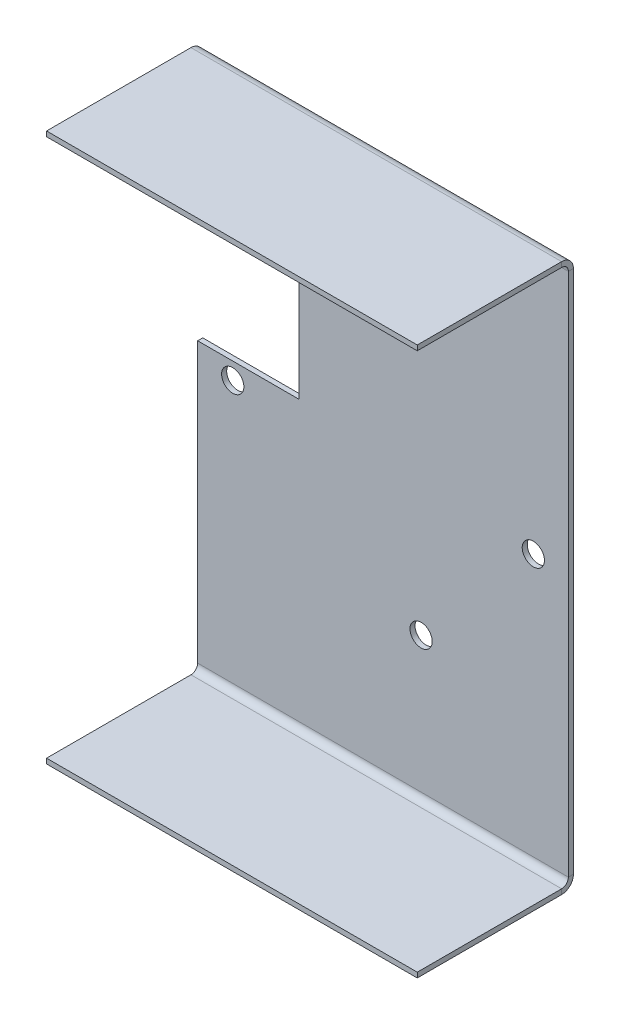
ISO-10303-21;
HEADER;
FILE_DESCRIPTION(('STEP AP214'),'2;1');
FILE_NAME('part.step','',(''),(''),'','','');
FILE_SCHEMA(('AUTOMOTIVE_DESIGN { 1 0 10303 214 1 1 1 1 }'));
ENDSEC;
DATA;
#1=APPLICATION_CONTEXT('core data for automotive mechanical design processes');
#2=APPLICATION_PROTOCOL_DEFINITION('international standard','automotive_design',2000,#1);
#3=PRODUCT_CONTEXT('',#1,'mechanical');
#4=PRODUCT('Part','Part','',(#3));
#5=PRODUCT_RELATED_PRODUCT_CATEGORY('part','',(#4));
#6=PRODUCT_DEFINITION_FORMATION('','',#4);
#7=PRODUCT_DEFINITION_CONTEXT('part definition',#1,'design');
#8=PRODUCT_DEFINITION('design','',#6,#7);
#9=PRODUCT_DEFINITION_SHAPE('','',#8);
#10=(LENGTH_UNIT() NAMED_UNIT(*) SI_UNIT(.MILLI.,.METRE.));
#11=(NAMED_UNIT(*) PLANE_ANGLE_UNIT() SI_UNIT($,.RADIAN.));
#12=(NAMED_UNIT(*) SI_UNIT($,.STERADIAN.) SOLID_ANGLE_UNIT());
#13=UNCERTAINTY_MEASURE_WITH_UNIT(LENGTH_MEASURE(1.E-05),#10,'distance_accuracy_value','');
#14=(GEOMETRIC_REPRESENTATION_CONTEXT(3) GLOBAL_UNCERTAINTY_ASSIGNED_CONTEXT((#13)) GLOBAL_UNIT_ASSIGNED_CONTEXT((#10,
#11,#12)) REPRESENTATION_CONTEXT('',''));
#15=CARTESIAN_POINT('',(0.,0.,0.));
#16=DIRECTION('',(0.,0.,1.));
#17=DIRECTION('',(1.,0.,0.));
#18=AXIS2_PLACEMENT_3D('',#15,#16,#17);
#19=CARTESIAN_POINT('',(-55.,125.,1.5));
#20=DIRECTION('',(-1.,0.,0.));
#21=DIRECTION('',(0.,-1.,0.));
#22=AXIS2_PLACEMENT_3D('',#19,#20,#21);
#23=PLANE('',#22);
#24=DIRECTION('',(0.,0.,-1.));
#25=VECTOR('',#24,1.);
#26=CARTESIAN_POINT('',(-55.,68.,10.));
#27=LINE('',#26,#25);
#28=CARTESIAN_POINT('',(-55.,68.,1.5));
#29=VERTEX_POINT('',#28);
#30=CARTESIAN_POINT('',(-55.,68.,0.));
#31=VERTEX_POINT('',#30);
#32=EDGE_CURVE('E190',#29,#31,#27,.T.);
#33=ORIENTED_EDGE('',*,*,#32,.F.);
#34=DIRECTION('',(0.,-1.,0.));
#35=VECTOR('',#34,1.);
#36=CARTESIAN_POINT('',(-55.,125.,1.5));
#37=LINE('',#36,#35);
#38=CARTESIAN_POINT('',(-54.9999999999999,77.840155050657,1.5));
#39=VERTEX_POINT('',#38);
#40=EDGE_CURVE('E208',#39,#29,#37,.T.);
#41=ORIENTED_EDGE('',*,*,#40,.F.);
#42=DIRECTION('',(0.,0.,-1.));
#43=VECTOR('',#42,1.);
#44=CARTESIAN_POINT('',(-55.,77.840155050657,1.5));
#45=LINE('',#44,#43);
#46=CARTESIAN_POINT('',(-55.,77.840155050657,0.));
#47=VERTEX_POINT('',#46);
#48=EDGE_CURVE('E14',#39,#47,#45,.T.);
#49=ORIENTED_EDGE('',*,*,#48,.T.);
#50=DIRECTION('',(0.,1.,0.));
#51=VECTOR('',#50,1.);
#52=CARTESIAN_POINT('',(-55.,0.,0.));
#53=LINE('',#52,#51);
#54=EDGE_CURVE('E197',#47,#31,#53,.F.);
#55=ORIENTED_EDGE('',*,*,#54,.T.);
#56=EDGE_LOOP('',(#33,#41,#49,#55));
#57=FACE_BOUND('',#56,.T.);
#58=ADVANCED_FACE('F58',(#57),#23,.T.);
#59=CARTESIAN_POINT('',(0.,0.,1.5));
#60=DIRECTION('',(0.,0.,1.));
#61=DIRECTION('',(1.,0.,0.));
#62=AXIS2_PLACEMENT_3D('',#59,#60,#61);
#63=PLANE('',#62);
#64=DIRECTION('',(-1.,0.,0.));
#65=VECTOR('',#64,1.);
#66=CARTESIAN_POINT('',(0.,68.,1.5));
#67=LINE('',#66,#65);
#68=CARTESIAN_POINT('',(-25.,68.,1.5));
#69=VERTEX_POINT('',#68);
#70=EDGE_CURVE('E305',#69,#29,#67,.T.);
#71=ORIENTED_EDGE('',*,*,#70,.F.);
#72=DIRECTION('',(0.,1.,0.));
#73=VECTOR('',#72,1.);
#74=CARTESIAN_POINT('',(-25.,0.,1.5));
#75=LINE('',#74,#73);
#76=CARTESIAN_POINT('',(-25.,5.,1.5));
#77=VERTEX_POINT('',#76);
#78=EDGE_CURVE('E349',#77,#69,#75,.T.);
#79=ORIENTED_EDGE('',*,*,#78,.F.);
#80=DIRECTION('',(1.,0.,0.));
#81=VECTOR('',#80,1.);
#82=CARTESIAN_POINT('',(0.,5.,1.5));
#83=LINE('',#82,#81);
#84=CARTESIAN_POINT('',(-55.,5.,1.5));
#85=VERTEX_POINT('',#84);
#86=EDGE_CURVE('E378',#85,#77,#83,.T.);
#87=ORIENTED_EDGE('',*,*,#86,.F.);
#88=CARTESIAN_POINT('',(-55.,-77.840155050657,1.5));
#89=VERTEX_POINT('',#88);
#90=EDGE_CURVE('E189',#85,#89,#37,.T.);
#91=ORIENTED_EDGE('',*,*,#90,.T.);
#92=DIRECTION('',(-1.,0.,0.));
#93=VECTOR('',#92,1.);
#94=CARTESIAN_POINT('',(0.,-77.840155050657,1.5));
#95=LINE('',#94,#93);
#96=CARTESIAN_POINT('',(55.,-77.840155050657,1.50000000000001));
#97=VERTEX_POINT('',#96);
#98=EDGE_CURVE('E239',#97,#89,#95,.T.);
#99=ORIENTED_EDGE('',*,*,#98,.F.);
#100=DIRECTION('',(0.,1.,0.));
#101=VECTOR('',#100,1.);
#102=CARTESIAN_POINT('',(55.,125.,1.5));
#103=LINE('',#102,#101);
#104=CARTESIAN_POINT('',(55.,77.840155050657,1.5));
#105=VERTEX_POINT('',#104);
#106=EDGE_CURVE('E62',#97,#105,#103,.T.);
#107=ORIENTED_EDGE('',*,*,#106,.T.);
#108=DIRECTION('',(-1.,0.,0.));
#109=VECTOR('',#108,1.);
#110=CARTESIAN_POINT('',(0.,77.840155050657,1.5));
#111=LINE('',#110,#109);
#112=EDGE_CURVE('E268',#105,#39,#111,.T.);
#113=ORIENTED_EDGE('',*,*,#112,.T.);
#114=ORIENTED_EDGE('',*,*,#40,.T.);
#115=EDGE_LOOP('',(#71,#79,#87,#91,#99,#107,#113,#114));
#116=FACE_BOUND('',#115,.T.);
#117=CARTESIAN_POINT('',(0.,51.,1.5));
#118=DIRECTION('',(0.,0.,1.));
#119=DIRECTION('',(1.,0.,0.));
#120=AXIS2_PLACEMENT_3D('',#117,#118,#119);
#121=CIRCLE('',#120,3.3);
#122=CARTESIAN_POINT('',(3.30000000000001,51.,1.5));
#123=VERTEX_POINT('',#122);
#124=EDGE_CURVE('E216',#123,#123,#121,.T.);
#125=ORIENTED_EDGE('',*,*,#124,.F.);
#126=EDGE_LOOP('',(#125));
#127=FACE_BOUND('',#126,.T.);
#128=CARTESIAN_POINT('',(-44.6,0.,1.5));
#129=DIRECTION('',(0.,0.,1.));
#130=DIRECTION('',(1.,0.,0.));
#131=AXIS2_PLACEMENT_3D('',#128,#129,#130);
#132=CIRCLE('',#131,3.3);
#133=CARTESIAN_POINT('',(-41.3,0.,1.5));
#134=VERTEX_POINT('',#133);
#135=EDGE_CURVE('E219',#134,#134,#132,.T.);
#136=ORIENTED_EDGE('',*,*,#135,.F.);
#137=EDGE_LOOP('',(#136));
#138=FACE_BOUND('',#137,.T.);
#139=CARTESIAN_POINT('',(44.6,0.,1.5));
#140=DIRECTION('',(0.,0.,1.));
#141=DIRECTION('',(1.,0.,0.));
#142=AXIS2_PLACEMENT_3D('',#139,#140,#141);
#143=CIRCLE('',#142,3.3);
#144=CARTESIAN_POINT('',(47.9,0.,1.5));
#145=VERTEX_POINT('',#144);
#146=EDGE_CURVE('E224',#145,#145,#143,.T.);
#147=ORIENTED_EDGE('',*,*,#146,.F.);
#148=EDGE_LOOP('',(#147));
#149=FACE_BOUND('',#148,.T.);
#150=CARTESIAN_POINT('',(11.3,-37.5,1.5));
#151=DIRECTION('',(0.,0.,1.));
#152=DIRECTION('',(1.,0.,0.));
#153=AXIS2_PLACEMENT_3D('',#150,#151,#152);
#154=CIRCLE('',#153,3.3);
#155=CARTESIAN_POINT('',(14.6,-37.5,1.5));
#156=VERTEX_POINT('',#155);
#157=EDGE_CURVE('E231',#156,#156,#154,.T.);
#158=ORIENTED_EDGE('',*,*,#157,.F.);
#159=EDGE_LOOP('',(#158));
#160=FACE_BOUND('',#159,.T.);
#161=ADVANCED_FACE('F302',(#116,#127,#138,#149,#160),#63,.T.);
#162=CARTESIAN_POINT('',(55.,125.,1.5));
#163=DIRECTION('',(1.,0.,0.));
#164=DIRECTION('',(0.,1.,0.));
#165=AXIS2_PLACEMENT_3D('',#162,#163,#164);
#166=PLANE('',#165);
#167=DIRECTION('',(0.,1.,0.));
#168=VECTOR('',#167,1.);
#169=CARTESIAN_POINT('',(55.,0.,0.));
#170=LINE('',#169,#168);
#171=CARTESIAN_POINT('',(55.,-77.840155050657,0.));
#172=VERTEX_POINT('',#171);
#173=CARTESIAN_POINT('',(55.,77.840155050657,0.));
#174=VERTEX_POINT('',#173);
#175=EDGE_CURVE('E205',#172,#174,#170,.T.);
#176=ORIENTED_EDGE('',*,*,#175,.T.);
#177=DIRECTION('',(0.,0.,1.));
#178=VECTOR('',#177,1.);
#179=CARTESIAN_POINT('',(55.,77.840155050657,1.5));
#180=LINE('',#179,#178);
#181=EDGE_CURVE('E276',#174,#105,#180,.T.);
#182=ORIENTED_EDGE('',*,*,#181,.T.);
#183=ORIENTED_EDGE('',*,*,#106,.F.);
#184=DIRECTION('',(0.,0.,1.));
#185=VECTOR('',#184,1.);
#186=CARTESIAN_POINT('',(55.,-77.840155050657,1.49999999999858));
#187=LINE('',#186,#185);
#188=EDGE_CURVE('E234',#172,#97,#187,.T.);
#189=ORIENTED_EDGE('',*,*,#188,.F.);
#190=EDGE_LOOP('',(#176,#182,#183,#189));
#191=FACE_BOUND('',#190,.T.);
#192=ADVANCED_FACE('F307',(#191),#166,.T.);
#193=DIRECTION('',(0.,0.,-1.));
#194=VECTOR('',#193,1.);
#195=CARTESIAN_POINT('',(-55.,5.,10.));
#196=LINE('',#195,#194);
#197=CARTESIAN_POINT('',(-55.,5.,0.));
#198=VERTEX_POINT('',#197);
#199=EDGE_CURVE('E177',#85,#198,#196,.T.);
#200=ORIENTED_EDGE('',*,*,#199,.T.);
#201=CARTESIAN_POINT('',(-55.,-77.840155050657,0.));
#202=VERTEX_POINT('',#201);
#203=EDGE_CURVE('E187',#198,#202,#53,.F.);
#204=ORIENTED_EDGE('',*,*,#203,.T.);
#205=DIRECTION('',(0.,0.,-1.));
#206=VECTOR('',#205,1.);
#207=CARTESIAN_POINT('',(-55.,-77.840155050657,1.49999999999858));
#208=LINE('',#207,#206);
#209=EDGE_CURVE('E237',#89,#202,#208,.T.);
#210=ORIENTED_EDGE('',*,*,#209,.F.);
#211=ORIENTED_EDGE('',*,*,#90,.F.);
#212=EDGE_LOOP('',(#200,#204,#210,#211));
#213=FACE_BOUND('',#212,.T.);
#214=ADVANCED_FACE('F60',(#213),#23,.T.);
#215=CARTESIAN_POINT('',(-55.,-79.8401550506578,-203.659844949343));
#216=DIRECTION('',(-1.,0.,0.));
#217=DIRECTION('',(0.,0.,1.));
#218=AXIS2_PLACEMENT_3D('',#215,#216,#217);
#219=PLANE('',#218);
#220=DIRECTION('',(0.,0.,1.));
#221=VECTOR('',#220,1.);
#222=CARTESIAN_POINT('',(-55.,-79.8401550506578,-203.659844949343));
#223=LINE('',#222,#221);
#224=CARTESIAN_POINT('',(-55.,-79.840155050657,3.5));
#225=VERTEX_POINT('',#224);
#226=CARTESIAN_POINT('',(-55.,-79.8401550506569,46.340155050657));
#227=VERTEX_POINT('',#226);
#228=EDGE_CURVE('E247',#225,#227,#223,.T.);
#229=ORIENTED_EDGE('',*,*,#228,.F.);
#230=DIRECTION('',(0.,-1.,0.));
#231=VECTOR('',#230,1.);
#232=CARTESIAN_POINT('',(-55.,-79.8401550506585,3.5));
#233=LINE('',#232,#231);
#234=CARTESIAN_POINT('',(-55.,-81.340155050657,3.50000000000001));
#235=VERTEX_POINT('',#234);
#236=EDGE_CURVE('E265',#225,#235,#233,.T.);
#237=ORIENTED_EDGE('',*,*,#236,.T.);
#238=DIRECTION('',(0.,0.,-1.));
#239=VECTOR('',#238,1.);
#240=CARTESIAN_POINT('',(-55.,-81.3401550506573,-78.659844949343));
#241=LINE('',#240,#239);
#242=CARTESIAN_POINT('',(-55.,-81.3401550506569,46.340155050657));
#243=VERTEX_POINT('',#242);
#244=EDGE_CURVE('E252',#235,#243,#241,.F.);
#245=ORIENTED_EDGE('',*,*,#244,.T.);
#246=DIRECTION('',(0.,1.,0.));
#247=VECTOR('',#246,1.);
#248=CARTESIAN_POINT('',(-55.,-79.8401550506569,46.340155050657));
#249=LINE('',#248,#247);
#250=EDGE_CURVE('E254',#243,#227,#249,.T.);
#251=ORIENTED_EDGE('',*,*,#250,.T.);
#252=EDGE_LOOP('',(#229,#237,#245,#251));
#253=FACE_BOUND('',#252,.T.);
#254=ADVANCED_FACE('F406',(#253),#219,.T.);
#255=CARTESIAN_POINT('',(55.,-79.8401550506578,-203.659844949343));
#256=DIRECTION('',(1.,0.,0.));
#257=DIRECTION('',(0.,0.,-1.));
#258=AXIS2_PLACEMENT_3D('',#255,#256,#257);
#259=PLANE('',#258);
#260=DIRECTION('',(0.,0.,-1.));
#261=VECTOR('',#260,1.);
#262=CARTESIAN_POINT('',(55.,-81.3401550506573,-78.659844949343));
#263=LINE('',#262,#261);
#264=CARTESIAN_POINT('',(55.,-81.3401550506569,46.340155050657));
#265=VERTEX_POINT('',#264);
#266=CARTESIAN_POINT('',(54.9999999999999,-81.340155050657,3.50000000000001));
#267=VERTEX_POINT('',#266);
#268=EDGE_CURVE('E200',#265,#267,#263,.T.);
#269=ORIENTED_EDGE('',*,*,#268,.T.);
#270=DIRECTION('',(0.,1.,0.));
#271=VECTOR('',#270,1.);
#272=CARTESIAN_POINT('',(55.,-79.8401550506585,3.5));
#273=LINE('',#272,#271);
#274=CARTESIAN_POINT('',(55.,-79.840155050657,3.50000000000001));
#275=VERTEX_POINT('',#274);
#276=EDGE_CURVE('E260',#267,#275,#273,.T.);
#277=ORIENTED_EDGE('',*,*,#276,.T.);
#278=DIRECTION('',(0.,0.,-1.));
#279=VECTOR('',#278,1.);
#280=CARTESIAN_POINT('',(55.,-79.8401550506578,-203.659844949343));
#281=LINE('',#280,#279);
#282=CARTESIAN_POINT('',(55.,-79.8401550506569,46.340155050657));
#283=VERTEX_POINT('',#282);
#284=EDGE_CURVE('E251',#283,#275,#281,.T.);
#285=ORIENTED_EDGE('',*,*,#284,.F.);
#286=DIRECTION('',(0.,1.,0.));
#287=VECTOR('',#286,1.);
#288=CARTESIAN_POINT('',(55.,-79.8401550506569,46.340155050657));
#289=LINE('',#288,#287);
#290=EDGE_CURVE('E246',#265,#283,#289,.T.);
#291=ORIENTED_EDGE('',*,*,#290,.F.);
#292=EDGE_LOOP('',(#269,#277,#285,#291));
#293=FACE_BOUND('',#292,.T.);
#294=ADVANCED_FACE('F411',(#293),#259,.T.);
#295=CARTESIAN_POINT('',(0.,-79.8401550506573,-78.659844949343));
#296=DIRECTION('',(0.,1.,0.));
#297=DIRECTION('',(1.,0.,0.));
#298=AXIS2_PLACEMENT_3D('',#295,#296,#297);
#299=PLANE('',#298);
#300=ORIENTED_EDGE('',*,*,#284,.T.);
#301=DIRECTION('',(-1.,0.,0.));
#302=VECTOR('',#301,1.);
#303=CARTESIAN_POINT('',(0.,-79.840155050657,3.5));
#304=LINE('',#303,#302);
#305=EDGE_CURVE('E257',#275,#225,#304,.T.);
#306=ORIENTED_EDGE('',*,*,#305,.T.);
#307=ORIENTED_EDGE('',*,*,#228,.T.);
#308=DIRECTION('',(1.,0.,0.));
#309=VECTOR('',#308,1.);
#310=CARTESIAN_POINT('',(-55.,-79.8401550506569,46.340155050657));
#311=LINE('',#310,#309);
#312=EDGE_CURVE('E243',#227,#283,#311,.T.);
#313=ORIENTED_EDGE('',*,*,#312,.T.);
#314=EDGE_LOOP('',(#300,#306,#307,#313));
#315=FACE_BOUND('',#314,.T.);
#316=ADVANCED_FACE('F441',(#315),#299,.T.);
#317=CARTESIAN_POINT('',(-55.,-79.8401550506569,46.340155050657));
#318=DIRECTION('',(0.,0.,1.));
#319=DIRECTION('',(1.,0.,0.));
#320=AXIS2_PLACEMENT_3D('',#317,#318,#319);
#321=PLANE('',#320);
#322=ORIENTED_EDGE('',*,*,#250,.F.);
#323=DIRECTION('',(1.,0.,0.));
#324=VECTOR('',#323,1.);
#325=CARTESIAN_POINT('',(0.,-81.3401550506569,46.340155050657));
#326=LINE('',#325,#324);
#327=EDGE_CURVE('E248',#243,#265,#326,.T.);
#328=ORIENTED_EDGE('',*,*,#327,.T.);
#329=ORIENTED_EDGE('',*,*,#290,.T.);
#330=ORIENTED_EDGE('',*,*,#312,.F.);
#331=EDGE_LOOP('',(#322,#328,#329,#330));
#332=FACE_BOUND('',#331,.T.);
#333=ADVANCED_FACE('F438',(#332),#321,.T.);
#334=CARTESIAN_POINT('',(0.,-81.3401550506573,-78.659844949343));
#335=DIRECTION('',(0.,1.,0.));
#336=DIRECTION('',(1.,0.,0.));
#337=AXIS2_PLACEMENT_3D('',#334,#335,#336);
#338=PLANE('',#337);
#339=DIRECTION('',(-1.,0.,0.));
#340=VECTOR('',#339,1.);
#341=CARTESIAN_POINT('',(0.,-81.340155050657,3.49999999999999));
#342=LINE('',#341,#340);
#343=EDGE_CURVE('E263',#267,#235,#342,.T.);
#344=ORIENTED_EDGE('',*,*,#343,.F.);
#345=ORIENTED_EDGE('',*,*,#268,.F.);
#346=ORIENTED_EDGE('',*,*,#327,.F.);
#347=ORIENTED_EDGE('',*,*,#244,.F.);
#348=EDGE_LOOP('',(#344,#345,#346,#347));
#349=FACE_BOUND('',#348,.T.);
#350=ADVANCED_FACE('F320',(#349),#338,.F.);
#351=CARTESIAN_POINT('',(11.3,-37.5,1.5));
#352=DIRECTION('',(0.,0.,1.));
#353=DIRECTION('',(1.,0.,0.));
#354=AXIS2_PLACEMENT_3D('',#351,#352,#353);
#355=CYLINDRICAL_SURFACE('',#354,3.3);
#356=ORIENTED_EDGE('',*,*,#157,.T.);
#357=EDGE_LOOP('',(#356));
#358=FACE_BOUND('',#357,.T.);
#359=CARTESIAN_POINT('',(11.3,-37.5,0.));
#360=DIRECTION('',(0.,0.,1.));
#361=DIRECTION('',(1.,0.,0.));
#362=AXIS2_PLACEMENT_3D('',#359,#360,#361);
#363=CIRCLE('',#362,3.3);
#364=CARTESIAN_POINT('',(14.6,-37.5,0.));
#365=VERTEX_POINT('',#364);
#366=EDGE_CURVE('E207',#365,#365,#363,.T.);
#367=ORIENTED_EDGE('',*,*,#366,.F.);
#368=EDGE_LOOP('',(#367));
#369=FACE_BOUND('',#368,.T.);
#370=ADVANCED_FACE('F316',(#358,#369),#355,.F.);
#371=CARTESIAN_POINT('',(44.6,0.,1.5));
#372=DIRECTION('',(0.,0.,1.));
#373=DIRECTION('',(1.,0.,0.));
#374=AXIS2_PLACEMENT_3D('',#371,#372,#373);
#375=CYLINDRICAL_SURFACE('',#374,3.3);
#376=ORIENTED_EDGE('',*,*,#146,.T.);
#377=EDGE_LOOP('',(#376));
#378=FACE_BOUND('',#377,.T.);
#379=CARTESIAN_POINT('',(44.6,0.,0.));
#380=DIRECTION('',(0.,0.,1.));
#381=DIRECTION('',(1.,0.,0.));
#382=AXIS2_PLACEMENT_3D('',#379,#380,#381);
#383=CIRCLE('',#382,3.3);
#384=CARTESIAN_POINT('',(47.9,0.,0.));
#385=VERTEX_POINT('',#384);
#386=EDGE_CURVE('E324',#385,#385,#383,.T.);
#387=ORIENTED_EDGE('',*,*,#386,.F.);
#388=EDGE_LOOP('',(#387));
#389=FACE_BOUND('',#388,.T.);
#390=ADVANCED_FACE('F319',(#378,#389),#375,.F.);
#391=CARTESIAN_POINT('',(-44.6,0.,1.5));
#392=DIRECTION('',(0.,0.,1.));
#393=DIRECTION('',(1.,0.,0.));
#394=AXIS2_PLACEMENT_3D('',#391,#392,#393);
#395=CYLINDRICAL_SURFACE('',#394,3.3);
#396=ORIENTED_EDGE('',*,*,#135,.T.);
#397=EDGE_LOOP('',(#396));
#398=FACE_BOUND('',#397,.T.);
#399=CARTESIAN_POINT('',(-44.6,0.,0.));
#400=DIRECTION('',(0.,0.,1.));
#401=DIRECTION('',(1.,0.,0.));
#402=AXIS2_PLACEMENT_3D('',#399,#400,#401);
#403=CIRCLE('',#402,3.3);
#404=CARTESIAN_POINT('',(-41.3,0.,0.));
#405=VERTEX_POINT('',#404);
#406=EDGE_CURVE('E326',#405,#405,#403,.T.);
#407=ORIENTED_EDGE('',*,*,#406,.F.);
#408=EDGE_LOOP('',(#407));
#409=FACE_BOUND('',#408,.T.);
#410=ADVANCED_FACE('F428',(#398,#409),#395,.F.);
#411=CARTESIAN_POINT('',(0.,51.,1.5));
#412=DIRECTION('',(0.,0.,1.));
#413=DIRECTION('',(1.,0.,0.));
#414=AXIS2_PLACEMENT_3D('',#411,#412,#413);
#415=CYLINDRICAL_SURFACE('',#414,3.3);
#416=ORIENTED_EDGE('',*,*,#124,.T.);
#417=EDGE_LOOP('',(#416));
#418=FACE_BOUND('',#417,.T.);
#419=CARTESIAN_POINT('',(0.,51.,0.));
#420=DIRECTION('',(0.,0.,1.));
#421=DIRECTION('',(1.,0.,0.));
#422=AXIS2_PLACEMENT_3D('',#419,#420,#421);
#423=CIRCLE('',#422,3.3);
#424=CARTESIAN_POINT('',(3.30000000000001,51.,0.));
#425=VERTEX_POINT('',#424);
#426=EDGE_CURVE('E201',#425,#425,#423,.T.);
#427=ORIENTED_EDGE('',*,*,#426,.F.);
#428=EDGE_LOOP('',(#427));
#429=FACE_BOUND('',#428,.T.);
#430=ADVANCED_FACE('F420',(#418,#429),#415,.F.);
#431=CARTESIAN_POINT('',(0.,0.,0.));
#432=DIRECTION('',(0.,0.,1.));
#433=DIRECTION('',(1.,0.,0.));
#434=AXIS2_PLACEMENT_3D('',#431,#432,#433);
#435=PLANE('',#434);
#436=DIRECTION('',(0.,-1.,0.));
#437=VECTOR('',#436,1.);
#438=CARTESIAN_POINT('',(-25.,5.,0.));
#439=LINE('',#438,#437);
#440=CARTESIAN_POINT('',(-25.,68.,0.));
#441=VERTEX_POINT('',#440);
#442=CARTESIAN_POINT('',(-25.,5.,0.));
#443=VERTEX_POINT('',#442);
#444=EDGE_CURVE('E75',#441,#443,#439,.T.);
#445=ORIENTED_EDGE('',*,*,#444,.F.);
#446=DIRECTION('',(1.,0.,0.));
#447=VECTOR('',#446,1.);
#448=CARTESIAN_POINT('',(-25.,68.,0.));
#449=LINE('',#448,#447);
#450=EDGE_CURVE('E182',#31,#441,#449,.T.);
#451=ORIENTED_EDGE('',*,*,#450,.F.);
#452=ORIENTED_EDGE('',*,*,#54,.F.);
#453=DIRECTION('',(-1.,0.,0.));
#454=VECTOR('',#453,1.);
#455=CARTESIAN_POINT('',(0.,77.840155050657,0.));
#456=LINE('',#455,#454);
#457=EDGE_CURVE('E67',#174,#47,#456,.T.);
#458=ORIENTED_EDGE('',*,*,#457,.F.);
#459=ORIENTED_EDGE('',*,*,#175,.F.);
#460=DIRECTION('',(-1.,0.,0.));
#461=VECTOR('',#460,1.);
#462=CARTESIAN_POINT('',(0.,-77.840155050657,0.));
#463=LINE('',#462,#461);
#464=EDGE_CURVE('E195',#172,#202,#463,.T.);
#465=ORIENTED_EDGE('',*,*,#464,.T.);
#466=ORIENTED_EDGE('',*,*,#203,.F.);
#467=DIRECTION('',(-1.,0.,0.));
#468=VECTOR('',#467,1.);
#469=CARTESIAN_POINT('',(-25.,5.,0.));
#470=LINE('',#469,#468);
#471=EDGE_CURVE('E174',#443,#198,#470,.T.);
#472=ORIENTED_EDGE('',*,*,#471,.F.);
#473=EDGE_LOOP('',(#445,#451,#452,#458,#459,#465,#466,#472));
#474=FACE_BOUND('',#473,.T.);
#475=ORIENTED_EDGE('',*,*,#366,.T.);
#476=EDGE_LOOP('',(#475));
#477=FACE_BOUND('',#476,.T.);
#478=ORIENTED_EDGE('',*,*,#386,.T.);
#479=EDGE_LOOP('',(#478));
#480=FACE_BOUND('',#479,.T.);
#481=ORIENTED_EDGE('',*,*,#406,.T.);
#482=EDGE_LOOP('',(#481));
#483=FACE_BOUND('',#482,.T.);
#484=ORIENTED_EDGE('',*,*,#426,.T.);
#485=EDGE_LOOP('',(#484));
#486=FACE_BOUND('',#485,.T.);
#487=ADVANCED_FACE('F192',(#474,#477,#480,#483,#486),#435,.F.);
#488=CARTESIAN_POINT('',(55.,-77.840155050657,3.5));
#489=DIRECTION('',(-1.,0.,0.));
#490=DIRECTION('',(0.,0.,1.));
#491=AXIS2_PLACEMENT_3D('',#488,#489,#490);
#492=PLANE('',#491);
#493=ORIENTED_EDGE('',*,*,#276,.F.);
#494=CARTESIAN_POINT('',(54.9999999999999,-77.840155050657,3.5));
#495=DIRECTION('',(1.,0.,0.));
#496=DIRECTION('',(0.,1.,0.));
#497=AXIS2_PLACEMENT_3D('',#494,#495,#496);
#498=CIRCLE('',#497,3.5);
#499=EDGE_CURVE('E299',#267,#172,#498,.T.);
#500=ORIENTED_EDGE('',*,*,#499,.T.);
#501=ORIENTED_EDGE('',*,*,#188,.T.);
#502=CARTESIAN_POINT('',(55.,-77.840155050657,3.5));
#503=DIRECTION('',(1.,0.,0.));
#504=DIRECTION('',(0.,0.,-1.));
#505=AXIS2_PLACEMENT_3D('',#502,#503,#504);
#506=CIRCLE('',#505,1.99999999999999);
#507=EDGE_CURVE('E337',#275,#97,#506,.T.);
#508=ORIENTED_EDGE('',*,*,#507,.F.);
#509=EDGE_LOOP('',(#493,#500,#501,#508));
#510=FACE_BOUND('',#509,.T.);
#511=ADVANCED_FACE('F419',(#510),#492,.F.);
#512=CARTESIAN_POINT('',(-55.,-77.840155050657,3.5));
#513=DIRECTION('',(1.,0.,0.));
#514=DIRECTION('',(0.,0.,-1.));
#515=AXIS2_PLACEMENT_3D('',#512,#513,#514);
#516=PLANE('',#515);
#517=CARTESIAN_POINT('',(-55.,-77.840155050657,3.5));
#518=DIRECTION('',(1.,0.,0.));
#519=DIRECTION('',(0.,1.,0.));
#520=AXIS2_PLACEMENT_3D('',#517,#518,#519);
#521=CIRCLE('',#520,3.5);
#522=EDGE_CURVE('E334',#202,#235,#521,.F.);
#523=ORIENTED_EDGE('',*,*,#522,.T.);
#524=ORIENTED_EDGE('',*,*,#236,.F.);
#525=CARTESIAN_POINT('',(-55.,-77.840155050657,3.5));
#526=DIRECTION('',(-1.,0.,0.));
#527=DIRECTION('',(0.,0.,1.));
#528=AXIS2_PLACEMENT_3D('',#525,#526,#527);
#529=CIRCLE('',#528,1.99999999999999);
#530=EDGE_CURVE('E242',#89,#225,#529,.T.);
#531=ORIENTED_EDGE('',*,*,#530,.F.);
#532=ORIENTED_EDGE('',*,*,#209,.T.);
#533=EDGE_LOOP('',(#523,#524,#531,#532));
#534=FACE_BOUND('',#533,.T.);
#535=ADVANCED_FACE('F425',(#534),#516,.F.);
#536=CARTESIAN_POINT('',(-110.095003160093,-77.840155050657,3.5));
#537=DIRECTION('',(1.,0.,0.));
#538=DIRECTION('',(0.,1.,0.));
#539=AXIS2_PLACEMENT_3D('',#536,#537,#538);
#540=CYLINDRICAL_SURFACE('',#539,2.);
#541=ORIENTED_EDGE('',*,*,#98,.T.);
#542=ORIENTED_EDGE('',*,*,#530,.T.);
#543=ORIENTED_EDGE('',*,*,#305,.F.);
#544=ORIENTED_EDGE('',*,*,#507,.T.);
#545=EDGE_LOOP('',(#541,#542,#543,#544));
#546=FACE_BOUND('',#545,.T.);
#547=ADVANCED_FACE('F465',(#546),#540,.F.);
#548=CARTESIAN_POINT('',(-110.095003160093,-77.840155050657,3.5));
#549=DIRECTION('',(1.,0.,0.));
#550=DIRECTION('',(0.,1.,0.));
#551=AXIS2_PLACEMENT_3D('',#548,#549,#550);
#552=CYLINDRICAL_SURFACE('',#551,3.5);
#553=ORIENTED_EDGE('',*,*,#464,.F.);
#554=ORIENTED_EDGE('',*,*,#499,.F.);
#555=ORIENTED_EDGE('',*,*,#343,.T.);
#556=ORIENTED_EDGE('',*,*,#522,.F.);
#557=EDGE_LOOP('',(#553,#554,#555,#556));
#558=FACE_BOUND('',#557,.T.);
#559=ADVANCED_FACE('F460',(#558),#552,.T.);
#560=CARTESIAN_POINT('',(55.,77.840155050657,3.5));
#561=DIRECTION('',(-1.,0.,0.));
#562=DIRECTION('',(0.,0.,1.));
#563=AXIS2_PLACEMENT_3D('',#560,#561,#562);
#564=PLANE('',#563);
#565=ORIENTED_EDGE('',*,*,#181,.F.);
#566=CARTESIAN_POINT('',(55.,77.840155050657,3.5));
#567=DIRECTION('',(-1.,0.,0.));
#568=DIRECTION('',(0.,-1.,0.));
#569=AXIS2_PLACEMENT_3D('',#566,#567,#568);
#570=CIRCLE('',#569,3.5);
#571=CARTESIAN_POINT('',(55.,81.340155050657,3.5));
#572=VERTEX_POINT('',#571);
#573=EDGE_CURVE('E284',#174,#572,#570,.F.);
#574=ORIENTED_EDGE('',*,*,#573,.T.);
#575=DIRECTION('',(0.,-1.,0.));
#576=VECTOR('',#575,1.);
#577=CARTESIAN_POINT('',(55.,79.840155050657,3.5));
#578=LINE('',#577,#576);
#579=CARTESIAN_POINT('',(55.,79.840155050657,3.5));
#580=VERTEX_POINT('',#579);
#581=EDGE_CURVE('E351',#572,#580,#578,.T.);
#582=ORIENTED_EDGE('',*,*,#581,.T.);
#583=CARTESIAN_POINT('',(55.,77.840155050657,3.5));
#584=DIRECTION('',(1.,0.,0.));
#585=DIRECTION('',(0.,0.,-1.));
#586=AXIS2_PLACEMENT_3D('',#583,#584,#585);
#587=CIRCLE('',#586,2.00000000000001);
#588=EDGE_CURVE('E300',#105,#580,#587,.T.);
#589=ORIENTED_EDGE('',*,*,#588,.F.);
#590=EDGE_LOOP('',(#565,#574,#582,#589));
#591=FACE_BOUND('',#590,.T.);
#592=ADVANCED_FACE('F469',(#591),#564,.F.);
#593=CARTESIAN_POINT('',(-55.,77.840155050657,3.5));
#594=DIRECTION('',(1.,0.,0.));
#595=DIRECTION('',(0.,0.,-1.));
#596=AXIS2_PLACEMENT_3D('',#593,#594,#595);
#597=PLANE('',#596);
#598=CARTESIAN_POINT('',(-54.9999999999999,77.840155050657,3.5));
#599=DIRECTION('',(-1.,0.,0.));
#600=DIRECTION('',(0.,-1.,0.));
#601=AXIS2_PLACEMENT_3D('',#598,#599,#600);
#602=CIRCLE('',#601,3.5);
#603=CARTESIAN_POINT('',(-55.,81.340155050657,3.5));
#604=VERTEX_POINT('',#603);
#605=EDGE_CURVE('E83',#604,#47,#602,.T.);
#606=ORIENTED_EDGE('',*,*,#605,.T.);
#607=ORIENTED_EDGE('',*,*,#48,.F.);
#608=CARTESIAN_POINT('',(-55.,77.840155050657,3.5));
#609=DIRECTION('',(-1.,0.,0.));
#610=DIRECTION('',(0.,0.,1.));
#611=AXIS2_PLACEMENT_3D('',#608,#609,#610);
#612=CIRCLE('',#611,2.00000000000001);
#613=CARTESIAN_POINT('',(-54.9999999999999,79.840155050657,3.50000000000002));
#614=VERTEX_POINT('',#613);
#615=EDGE_CURVE('E292',#614,#39,#612,.T.);
#616=ORIENTED_EDGE('',*,*,#615,.F.);
#617=DIRECTION('',(0.,1.,0.));
#618=VECTOR('',#617,1.);
#619=CARTESIAN_POINT('',(-55.,79.840155050657,3.5));
#620=LINE('',#619,#618);
#621=EDGE_CURVE('E348',#614,#604,#620,.T.);
#622=ORIENTED_EDGE('',*,*,#621,.T.);
#623=EDGE_LOOP('',(#606,#607,#616,#622));
#624=FACE_BOUND('',#623,.T.);
#625=ADVANCED_FACE('F291',(#624),#597,.F.);
#626=CARTESIAN_POINT('',(110.095003160093,77.840155050657,3.5));
#627=DIRECTION('',(-1.,0.,0.));
#628=DIRECTION('',(0.,-1.,0.));
#629=AXIS2_PLACEMENT_3D('',#626,#627,#628);
#630=CYLINDRICAL_SURFACE('',#629,2.);
#631=DIRECTION('',(-1.,0.,0.));
#632=VECTOR('',#631,1.);
#633=CARTESIAN_POINT('',(0.,79.840155050657,3.5));
#634=LINE('',#633,#632);
#635=EDGE_CURVE('E298',#580,#614,#634,.T.);
#636=ORIENTED_EDGE('',*,*,#635,.T.);
#637=ORIENTED_EDGE('',*,*,#615,.T.);
#638=ORIENTED_EDGE('',*,*,#112,.F.);
#639=ORIENTED_EDGE('',*,*,#588,.T.);
#640=EDGE_LOOP('',(#636,#637,#638,#639));
#641=FACE_BOUND('',#640,.T.);
#642=ADVANCED_FACE('F295',(#641),#630,.F.);
#643=CARTESIAN_POINT('',(110.095003160093,77.840155050657,3.5));
#644=DIRECTION('',(-1.,0.,0.));
#645=DIRECTION('',(0.,-1.,0.));
#646=AXIS2_PLACEMENT_3D('',#643,#644,#645);
#647=CYLINDRICAL_SURFACE('',#646,3.5);
#648=DIRECTION('',(-1.,0.,0.));
#649=VECTOR('',#648,1.);
#650=CARTESIAN_POINT('',(0.,81.340155050657,3.5));
#651=LINE('',#650,#649);
#652=EDGE_CURVE('E372',#572,#604,#651,.T.);
#653=ORIENTED_EDGE('',*,*,#652,.F.);
#654=ORIENTED_EDGE('',*,*,#573,.F.);
#655=ORIENTED_EDGE('',*,*,#457,.T.);
#656=ORIENTED_EDGE('',*,*,#605,.F.);
#657=EDGE_LOOP('',(#653,#654,#655,#656));
#658=FACE_BOUND('',#657,.T.);
#659=ADVANCED_FACE('F282',(#658),#647,.T.);
#660=CARTESIAN_POINT('',(-55.,79.8401550506569,46.340155050657));
#661=DIRECTION('',(0.,0.,1.));
#662=DIRECTION('',(-1.,0.,0.));
#663=AXIS2_PLACEMENT_3D('',#660,#661,#662);
#664=PLANE('',#663);
#665=DIRECTION('',(1.,0.,0.));
#666=VECTOR('',#665,1.);
#667=CARTESIAN_POINT('',(0.,81.3401550506569,46.340155050657));
#668=LINE('',#667,#666);
#669=CARTESIAN_POINT('',(55.,81.3401550506568,46.340155050657));
#670=VERTEX_POINT('',#669);
#671=CARTESIAN_POINT('',(-55.,81.3401550506569,46.340155050657));
#672=VERTEX_POINT('',#671);
#673=EDGE_CURVE('E354',#670,#672,#668,.F.);
#674=ORIENTED_EDGE('',*,*,#673,.T.);
#675=DIRECTION('',(0.,-1.,0.));
#676=VECTOR('',#675,1.);
#677=CARTESIAN_POINT('',(-55.,79.8401550506569,46.340155050657));
#678=LINE('',#677,#676);
#679=CARTESIAN_POINT('',(-55.,79.8401550506569,46.340155050657));
#680=VERTEX_POINT('',#679);
#681=EDGE_CURVE('E357',#672,#680,#678,.T.);
#682=ORIENTED_EDGE('',*,*,#681,.T.);
#683=DIRECTION('',(-1.,0.,0.));
#684=VECTOR('',#683,1.);
#685=CARTESIAN_POINT('',(-55.,79.8401550506569,46.340155050657));
#686=LINE('',#685,#684);
#687=CARTESIAN_POINT('',(55.,79.8401550506568,46.340155050657));
#688=VERTEX_POINT('',#687);
#689=EDGE_CURVE('E361',#688,#680,#686,.T.);
#690=ORIENTED_EDGE('',*,*,#689,.F.);
#691=DIRECTION('',(0.,-1.,0.));
#692=VECTOR('',#691,1.);
#693=CARTESIAN_POINT('',(55.,79.8401550506568,46.340155050657));
#694=LINE('',#693,#692);
#695=EDGE_CURVE('E369',#670,#688,#694,.T.);
#696=ORIENTED_EDGE('',*,*,#695,.F.);
#697=EDGE_LOOP('',(#674,#682,#690,#696));
#698=FACE_BOUND('',#697,.T.);
#699=ADVANCED_FACE('F483',(#698),#664,.T.);
#700=CARTESIAN_POINT('',(0.,79.8401550506573,-78.659844949343));
#701=DIRECTION('',(0.,-1.,0.));
#702=DIRECTION('',(1.,0.,0.));
#703=AXIS2_PLACEMENT_3D('',#700,#701,#702);
#704=PLANE('',#703);
#705=ORIENTED_EDGE('',*,*,#635,.F.);
#706=DIRECTION('',(0.,0.,1.));
#707=VECTOR('',#706,1.);
#708=CARTESIAN_POINT('',(55.,79.8401550506568,46.340155050657));
#709=LINE('',#708,#707);
#710=EDGE_CURVE('E359',#580,#688,#709,.T.);
#711=ORIENTED_EDGE('',*,*,#710,.T.);
#712=ORIENTED_EDGE('',*,*,#689,.T.);
#713=DIRECTION('',(0.,0.,-1.));
#714=VECTOR('',#713,1.);
#715=CARTESIAN_POINT('',(-55.,79.8401550506569,46.340155050657));
#716=LINE('',#715,#714);
#717=EDGE_CURVE('E364',#680,#614,#716,.T.);
#718=ORIENTED_EDGE('',*,*,#717,.T.);
#719=EDGE_LOOP('',(#705,#711,#712,#718));
#720=FACE_BOUND('',#719,.T.);
#721=ADVANCED_FACE('F480',(#720),#704,.T.);
#722=CARTESIAN_POINT('',(55.,79.8401550506568,46.340155050657));
#723=DIRECTION('',(1.,0.,0.));
#724=DIRECTION('',(0.,0.,1.));
#725=AXIS2_PLACEMENT_3D('',#722,#723,#724);
#726=PLANE('',#725);
#727=ORIENTED_EDGE('',*,*,#581,.F.);
#728=DIRECTION('',(0.,0.,1.));
#729=VECTOR('',#728,1.);
#730=CARTESIAN_POINT('',(55.,81.3401550506573,-78.659844949343));
#731=LINE('',#730,#729);
#732=EDGE_CURVE('E367',#572,#670,#731,.T.);
#733=ORIENTED_EDGE('',*,*,#732,.T.);
#734=ORIENTED_EDGE('',*,*,#695,.T.);
#735=ORIENTED_EDGE('',*,*,#710,.F.);
#736=EDGE_LOOP('',(#727,#733,#734,#735));
#737=FACE_BOUND('',#736,.T.);
#738=ADVANCED_FACE('F473',(#737),#726,.T.);
#739=CARTESIAN_POINT('',(0.,81.3401550506573,-78.659844949343));
#740=DIRECTION('',(0.,-1.,0.));
#741=DIRECTION('',(1.,0.,0.));
#742=AXIS2_PLACEMENT_3D('',#739,#740,#741);
#743=PLANE('',#742);
#744=ORIENTED_EDGE('',*,*,#732,.F.);
#745=ORIENTED_EDGE('',*,*,#652,.T.);
#746=DIRECTION('',(0.,0.,1.));
#747=VECTOR('',#746,1.);
#748=CARTESIAN_POINT('',(-55.,81.3401550506573,-78.659844949343));
#749=LINE('',#748,#747);
#750=EDGE_CURVE('E344',#672,#604,#749,.F.);
#751=ORIENTED_EDGE('',*,*,#750,.F.);
#752=ORIENTED_EDGE('',*,*,#673,.F.);
#753=EDGE_LOOP('',(#744,#745,#751,#752));
#754=FACE_BOUND('',#753,.T.);
#755=ADVANCED_FACE('F397',(#754),#743,.F.);
#756=CARTESIAN_POINT('',(-55.,79.8401550506569,46.340155050657));
#757=DIRECTION('',(-1.,0.,0.));
#758=DIRECTION('',(0.,0.,-1.));
#759=AXIS2_PLACEMENT_3D('',#756,#757,#758);
#760=PLANE('',#759);
#761=ORIENTED_EDGE('',*,*,#621,.F.);
#762=ORIENTED_EDGE('',*,*,#717,.F.);
#763=ORIENTED_EDGE('',*,*,#681,.F.);
#764=ORIENTED_EDGE('',*,*,#750,.T.);
#765=EDGE_LOOP('',(#761,#762,#763,#764));
#766=FACE_BOUND('',#765,.T.);
#767=ADVANCED_FACE('F390',(#766),#760,.T.);
#768=CARTESIAN_POINT('',(-25.,5.,10.));
#769=DIRECTION('',(1.,0.,0.));
#770=DIRECTION('',(0.,0.,-1.));
#771=AXIS2_PLACEMENT_3D('',#768,#769,#770);
#772=PLANE('',#771);
#773=ORIENTED_EDGE('',*,*,#78,.T.);
#774=DIRECTION('',(0.,0.,-1.));
#775=VECTOR('',#774,1.);
#776=CARTESIAN_POINT('',(-25.,68.,10.));
#777=LINE('',#776,#775);
#778=EDGE_CURVE('E380',#69,#441,#777,.T.);
#779=ORIENTED_EDGE('',*,*,#778,.T.);
#780=ORIENTED_EDGE('',*,*,#444,.T.);
#781=DIRECTION('',(0.,0.,-1.));
#782=VECTOR('',#781,1.);
#783=CARTESIAN_POINT('',(-25.,5.,10.));
#784=LINE('',#783,#782);
#785=EDGE_CURVE('E179',#77,#443,#784,.T.);
#786=ORIENTED_EDGE('',*,*,#785,.F.);
#787=EDGE_LOOP('',(#773,#779,#780,#786));
#788=FACE_BOUND('',#787,.T.);
#789=ADVANCED_FACE('F388',(#788),#772,.F.);
#790=CARTESIAN_POINT('',(-25.,68.,10.));
#791=DIRECTION('',(0.,1.,0.));
#792=DIRECTION('',(0.,0.,1.));
#793=AXIS2_PLACEMENT_3D('',#790,#791,#792);
#794=PLANE('',#793);
#795=ORIENTED_EDGE('',*,*,#70,.T.);
#796=ORIENTED_EDGE('',*,*,#32,.T.);
#797=ORIENTED_EDGE('',*,*,#450,.T.);
#798=ORIENTED_EDGE('',*,*,#778,.F.);
#799=EDGE_LOOP('',(#795,#796,#797,#798));
#800=FACE_BOUND('',#799,.T.);
#801=ADVANCED_FACE('F387',(#800),#794,.F.);
#802=CARTESIAN_POINT('',(-25.,5.,10.));
#803=DIRECTION('',(0.,-1.,0.));
#804=DIRECTION('',(0.,0.,-1.));
#805=AXIS2_PLACEMENT_3D('',#802,#803,#804);
#806=PLANE('',#805);
#807=ORIENTED_EDGE('',*,*,#86,.T.);
#808=ORIENTED_EDGE('',*,*,#785,.T.);
#809=ORIENTED_EDGE('',*,*,#471,.T.);
#810=ORIENTED_EDGE('',*,*,#199,.F.);
#811=EDGE_LOOP('',(#807,#808,#809,#810));
#812=FACE_BOUND('',#811,.T.);
#813=ADVANCED_FACE('F176',(#812),#806,.F.);
#814=CLOSED_SHELL('',(#58,#161,#192,#214,#254,#294,#316,#333,#350,#370,#390,#410,#430,#487,#511,
#535,#547,#559,#592,#625,#642,#659,#699,#721,#738,#755,#767,#789,#801,#813));
#815=MANIFOLD_SOLID_BREP('B2',#814);
#816=ADVANCED_BREP_SHAPE_REPRESENTATION('',(#18,#815),#14);
#817=SHAPE_DEFINITION_REPRESENTATION(#9,#816);
ENDSEC;
END-ISO-10303-21;
